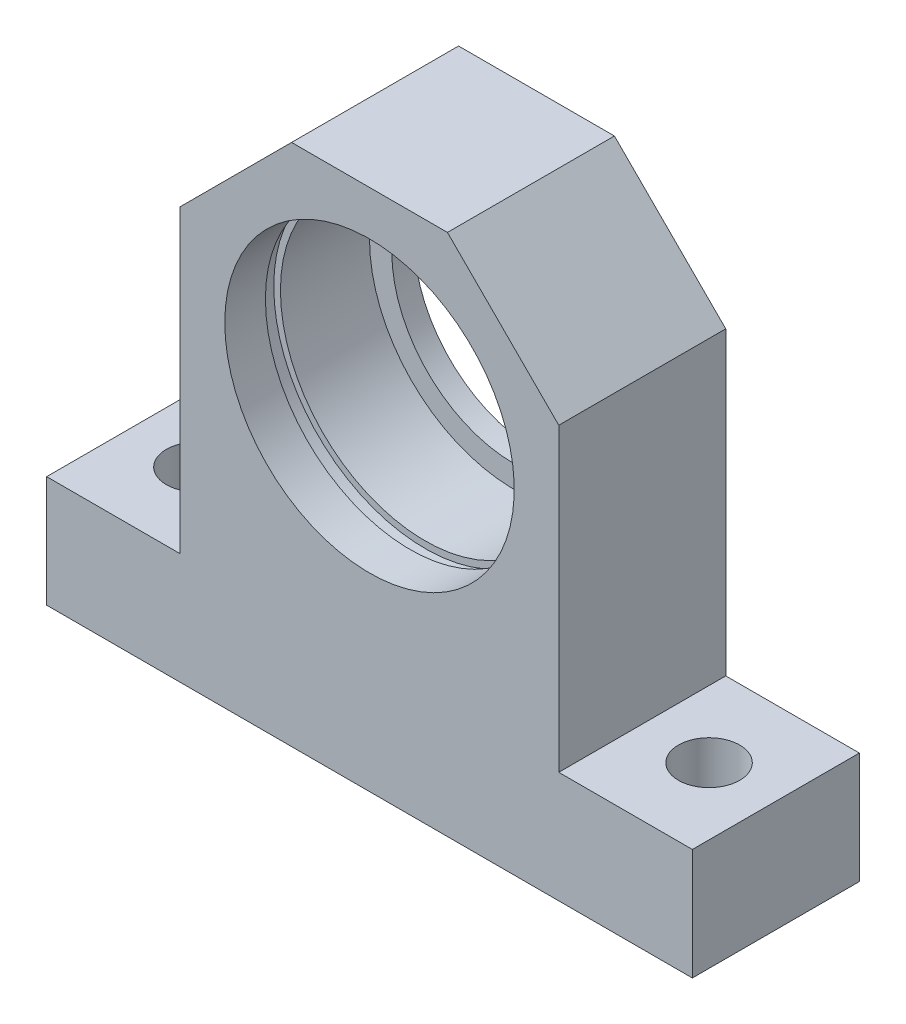
ISO-10303-21;
HEADER;
FILE_DESCRIPTION(('STEP AP214'),'2;1');
FILE_NAME('part.step','',(''),(''),'','','');
FILE_SCHEMA(('AUTOMOTIVE_DESIGN { 1 0 10303 214 1 1 1 1 }'));
ENDSEC;
DATA;
#1=APPLICATION_CONTEXT('core data for automotive mechanical design processes');
#2=APPLICATION_PROTOCOL_DEFINITION('international standard','automotive_design',2000,#1);
#3=PRODUCT_CONTEXT('',#1,'mechanical');
#4=PRODUCT('Part','Part','',(#3));
#5=PRODUCT_RELATED_PRODUCT_CATEGORY('part','',(#4));
#6=PRODUCT_DEFINITION_FORMATION('','',#4);
#7=PRODUCT_DEFINITION_CONTEXT('part definition',#1,'design');
#8=PRODUCT_DEFINITION('design','',#6,#7);
#9=PRODUCT_DEFINITION_SHAPE('','',#8);
#10=(LENGTH_UNIT() NAMED_UNIT(*) SI_UNIT(.MILLI.,.METRE.));
#11=(NAMED_UNIT(*) PLANE_ANGLE_UNIT() SI_UNIT($,.RADIAN.));
#12=(NAMED_UNIT(*) SI_UNIT($,.STERADIAN.) SOLID_ANGLE_UNIT());
#13=UNCERTAINTY_MEASURE_WITH_UNIT(LENGTH_MEASURE(1.E-05),#10,'distance_accuracy_value','');
#14=(GEOMETRIC_REPRESENTATION_CONTEXT(3) GLOBAL_UNCERTAINTY_ASSIGNED_CONTEXT((#13)) GLOBAL_UNIT_ASSIGNED_CONTEXT((#10,
#11,#12)) REPRESENTATION_CONTEXT('',''));
#15=CARTESIAN_POINT('',(0.,0.,0.));
#16=DIRECTION('',(0.,0.,1.));
#17=DIRECTION('',(1.,0.,0.));
#18=AXIS2_PLACEMENT_3D('',#15,#16,#17);
#19=CARTESIAN_POINT('',(29.,0.,-15.));
#20=DIRECTION('',(0.,-1.,0.));
#21=DIRECTION('',(0.,0.,-1.));
#22=AXIS2_PLACEMENT_3D('',#19,#20,#21);
#23=PLANE('',#22);
#24=CARTESIAN_POINT('',(-23.,0.,-7.5));
#25=DIRECTION('',(0.,1.,0.));
#26=DIRECTION('',(0.,0.,1.));
#27=AXIS2_PLACEMENT_3D('',#24,#25,#26);
#28=CIRCLE('',#27,2.75);
#29=CARTESIAN_POINT('',(-23.,0.,-4.75));
#30=VERTEX_POINT('',#29);
#31=EDGE_CURVE('E442',#30,#30,#28,.T.);
#32=ORIENTED_EDGE('',*,*,#31,.T.);
#33=EDGE_LOOP('',(#32));
#34=FACE_BOUND('',#33,.T.);
#35=DIRECTION('',(1.,0.,0.));
#36=VECTOR('',#35,1.);
#37=CARTESIAN_POINT('',(29.,0.,0.));
#38=LINE('',#37,#36);
#39=CARTESIAN_POINT('',(-29.,0.,0.));
#40=VERTEX_POINT('',#39);
#41=CARTESIAN_POINT('',(29.,0.,0.));
#42=VERTEX_POINT('',#41);
#43=EDGE_CURVE('E154',#40,#42,#38,.T.);
#44=ORIENTED_EDGE('',*,*,#43,.F.);
#45=DIRECTION('',(0.,0.,1.));
#46=VECTOR('',#45,1.);
#47=CARTESIAN_POINT('',(-29.,0.,-15.));
#48=LINE('',#47,#46);
#49=CARTESIAN_POINT('',(-29.,0.,-15.));
#50=VERTEX_POINT('',#49);
#51=EDGE_CURVE('E175',#50,#40,#48,.T.);
#52=ORIENTED_EDGE('',*,*,#51,.F.);
#53=DIRECTION('',(1.,0.,0.));
#54=VECTOR('',#53,1.);
#55=CARTESIAN_POINT('',(29.,0.,-15.));
#56=LINE('',#55,#54);
#57=CARTESIAN_POINT('',(29.,0.,-15.));
#58=VERTEX_POINT('',#57);
#59=EDGE_CURVE('E131',#50,#58,#56,.T.);
#60=ORIENTED_EDGE('',*,*,#59,.T.);
#61=DIRECTION('',(0.,0.,1.));
#62=VECTOR('',#61,1.);
#63=CARTESIAN_POINT('',(29.,0.,-15.));
#64=LINE('',#63,#62);
#65=EDGE_CURVE('E173',#58,#42,#64,.T.);
#66=ORIENTED_EDGE('',*,*,#65,.T.);
#67=EDGE_LOOP('',(#44,#52,#60,#66));
#68=FACE_BOUND('',#67,.T.);
#69=CARTESIAN_POINT('',(23.,0.,-7.5));
#70=DIRECTION('',(0.,1.,0.));
#71=DIRECTION('',(0.,0.,1.));
#72=AXIS2_PLACEMENT_3D('',#69,#70,#71);
#73=CIRCLE('',#72,2.75);
#74=CARTESIAN_POINT('',(23.,0.,-4.75));
#75=VERTEX_POINT('',#74);
#76=EDGE_CURVE('E436',#75,#75,#73,.T.);
#77=ORIENTED_EDGE('',*,*,#76,.T.);
#78=EDGE_LOOP('',(#77));
#79=FACE_BOUND('',#78,.T.);
#80=ADVANCED_FACE('F33',(#34,#68,#79),#23,.T.);
#81=CARTESIAN_POINT('',(-17.,9.99999999999999,-15.));
#82=DIRECTION('',(-1.,0.,0.));
#83=DIRECTION('',(0.,-1.,0.));
#84=AXIS2_PLACEMENT_3D('',#81,#82,#83);
#85=PLANE('',#84);
#86=DIRECTION('',(0.,-1.,0.));
#87=VECTOR('',#86,1.);
#88=CARTESIAN_POINT('',(-17.,9.99999999999999,0.));
#89=LINE('',#88,#87);
#90=CARTESIAN_POINT('',(-17.,36.9999999999999,0.));
#91=VERTEX_POINT('',#90);
#92=CARTESIAN_POINT('',(-17.,9.99999999999999,0.));
#93=VERTEX_POINT('',#92);
#94=EDGE_CURVE('E147',#91,#93,#89,.T.);
#95=ORIENTED_EDGE('',*,*,#94,.F.);
#96=DIRECTION('',(0.,0.,-1.));
#97=VECTOR('',#96,1.);
#98=CARTESIAN_POINT('',(-17.,36.9999999999999,-15.));
#99=LINE('',#98,#97);
#100=CARTESIAN_POINT('',(-17.,36.9999999999999,-15.));
#101=VERTEX_POINT('',#100);
#102=EDGE_CURVE('E11',#91,#101,#99,.T.);
#103=ORIENTED_EDGE('',*,*,#102,.T.);
#104=DIRECTION('',(0.,-1.,0.));
#105=VECTOR('',#104,1.);
#106=CARTESIAN_POINT('',(-17.,9.99999999999999,-15.));
#107=LINE('',#106,#105);
#108=CARTESIAN_POINT('',(-17.,9.99999999999999,-15.));
#109=VERTEX_POINT('',#108);
#110=EDGE_CURVE('E108',#101,#109,#107,.T.);
#111=ORIENTED_EDGE('',*,*,#110,.T.);
#112=DIRECTION('',(0.,0.,1.));
#113=VECTOR('',#112,1.);
#114=CARTESIAN_POINT('',(-17.,9.99999999999999,-15.));
#115=LINE('',#114,#113);
#116=EDGE_CURVE('E111',#109,#93,#115,.T.);
#117=ORIENTED_EDGE('',*,*,#116,.T.);
#118=EDGE_LOOP('',(#95,#103,#111,#117));
#119=FACE_BOUND('',#118,.T.);
#120=ADVANCED_FACE('F110',(#119),#85,.T.);
#121=CARTESIAN_POINT('',(-17.,47.,-15.));
#122=DIRECTION('',(0.,1.,0.));
#123=DIRECTION('',(-1.,0.,0.));
#124=AXIS2_PLACEMENT_3D('',#121,#122,#123);
#125=PLANE('',#124);
#126=DIRECTION('',(-1.,0.,0.));
#127=VECTOR('',#126,1.);
#128=CARTESIAN_POINT('',(-17.,47.,0.));
#129=LINE('',#128,#127);
#130=CARTESIAN_POINT('',(6.99999999999998,47.,0.));
#131=VERTEX_POINT('',#130);
#132=CARTESIAN_POINT('',(-6.99999999999999,47.,0.));
#133=VERTEX_POINT('',#132);
#134=EDGE_CURVE('E115',#131,#133,#129,.T.);
#135=ORIENTED_EDGE('',*,*,#134,.F.);
#136=DIRECTION('',(0.,0.,-1.));
#137=VECTOR('',#136,1.);
#138=CARTESIAN_POINT('',(6.99999999999998,47.,-15.));
#139=LINE('',#138,#137);
#140=CARTESIAN_POINT('',(6.99999999999998,47.,-15.));
#141=VERTEX_POINT('',#140);
#142=EDGE_CURVE('E187',#131,#141,#139,.T.);
#143=ORIENTED_EDGE('',*,*,#142,.T.);
#144=DIRECTION('',(-1.,0.,0.));
#145=VECTOR('',#144,1.);
#146=CARTESIAN_POINT('',(-17.,47.,-15.));
#147=LINE('',#146,#145);
#148=CARTESIAN_POINT('',(-6.99999999999999,47.,-15.));
#149=VERTEX_POINT('',#148);
#150=EDGE_CURVE('E123',#141,#149,#147,.T.);
#151=ORIENTED_EDGE('',*,*,#150,.T.);
#152=DIRECTION('',(0.,0.,1.));
#153=VECTOR('',#152,1.);
#154=CARTESIAN_POINT('',(-6.99999999999999,47.,-15.));
#155=LINE('',#154,#153);
#156=EDGE_CURVE('E184',#149,#133,#155,.T.);
#157=ORIENTED_EDGE('',*,*,#156,.T.);
#158=EDGE_LOOP('',(#135,#143,#151,#157));
#159=FACE_BOUND('',#158,.T.);
#160=ADVANCED_FACE('F203',(#159),#125,.T.);
#161=CARTESIAN_POINT('',(17.,47.,-15.));
#162=DIRECTION('',(1.,0.,0.));
#163=DIRECTION('',(0.,1.,0.));
#164=AXIS2_PLACEMENT_3D('',#161,#162,#163);
#165=PLANE('',#164);
#166=DIRECTION('',(0.,1.,0.));
#167=VECTOR('',#166,1.);
#168=CARTESIAN_POINT('',(17.,47.,-15.));
#169=LINE('',#168,#167);
#170=CARTESIAN_POINT('',(17.,10.,-15.));
#171=VERTEX_POINT('',#170);
#172=CARTESIAN_POINT('',(17.,37.,-15.));
#173=VERTEX_POINT('',#172);
#174=EDGE_CURVE('E143',#171,#173,#169,.T.);
#175=ORIENTED_EDGE('',*,*,#174,.T.);
#176=DIRECTION('',(0.,0.,1.));
#177=VECTOR('',#176,1.);
#178=CARTESIAN_POINT('',(17.,37.,-15.));
#179=LINE('',#178,#177);
#180=CARTESIAN_POINT('',(17.,37.,0.));
#181=VERTEX_POINT('',#180);
#182=EDGE_CURVE('E170',#173,#181,#179,.T.);
#183=ORIENTED_EDGE('',*,*,#182,.T.);
#184=DIRECTION('',(0.,1.,0.));
#185=VECTOR('',#184,1.);
#186=CARTESIAN_POINT('',(17.,47.,0.));
#187=LINE('',#186,#185);
#188=CARTESIAN_POINT('',(17.,10.,0.));
#189=VERTEX_POINT('',#188);
#190=EDGE_CURVE('E163',#189,#181,#187,.T.);
#191=ORIENTED_EDGE('',*,*,#190,.F.);
#192=DIRECTION('',(0.,0.,1.));
#193=VECTOR('',#192,1.);
#194=CARTESIAN_POINT('',(17.,10.,-15.));
#195=LINE('',#194,#193);
#196=EDGE_CURVE('E168',#171,#189,#195,.T.);
#197=ORIENTED_EDGE('',*,*,#196,.F.);
#198=EDGE_LOOP('',(#175,#183,#191,#197));
#199=FACE_BOUND('',#198,.T.);
#200=ADVANCED_FACE('F196',(#199),#165,.T.);
#201=CARTESIAN_POINT('',(17.,10.,-15.));
#202=DIRECTION('',(0.,1.,0.));
#203=DIRECTION('',(-1.,0.,0.));
#204=AXIS2_PLACEMENT_3D('',#201,#202,#203);
#205=PLANE('',#204);
#206=CARTESIAN_POINT('',(23.,10.,-7.5));
#207=DIRECTION('',(0.,1.,0.));
#208=DIRECTION('',(0.,0.,1.));
#209=AXIS2_PLACEMENT_3D('',#206,#207,#208);
#210=CIRCLE('',#209,2.74999999999999);
#211=CARTESIAN_POINT('',(23.,10.,-4.75000000000001));
#212=VERTEX_POINT('',#211);
#213=EDGE_CURVE('E439',#212,#212,#210,.T.);
#214=ORIENTED_EDGE('',*,*,#213,.F.);
#215=EDGE_LOOP('',(#214));
#216=FACE_BOUND('',#215,.T.);
#217=DIRECTION('',(-1.,0.,0.));
#218=VECTOR('',#217,1.);
#219=CARTESIAN_POINT('',(17.,10.,0.));
#220=LINE('',#219,#218);
#221=CARTESIAN_POINT('',(29.,9.99999999999999,0.));
#222=VERTEX_POINT('',#221);
#223=EDGE_CURVE('E160',#222,#189,#220,.T.);
#224=ORIENTED_EDGE('',*,*,#223,.F.);
#225=DIRECTION('',(0.,0.,1.));
#226=VECTOR('',#225,1.);
#227=CARTESIAN_POINT('',(29.,9.99999999999999,-15.));
#228=LINE('',#227,#226);
#229=CARTESIAN_POINT('',(29.,9.99999999999999,-15.));
#230=VERTEX_POINT('',#229);
#231=EDGE_CURVE('E171',#230,#222,#228,.T.);
#232=ORIENTED_EDGE('',*,*,#231,.F.);
#233=DIRECTION('',(-1.,0.,0.));
#234=VECTOR('',#233,1.);
#235=CARTESIAN_POINT('',(17.,10.,-15.));
#236=LINE('',#235,#234);
#237=EDGE_CURVE('E140',#230,#171,#236,.T.);
#238=ORIENTED_EDGE('',*,*,#237,.T.);
#239=ORIENTED_EDGE('',*,*,#196,.T.);
#240=EDGE_LOOP('',(#224,#232,#238,#239));
#241=FACE_BOUND('',#240,.T.);
#242=ADVANCED_FACE('F218',(#216,#241),#205,.T.);
#243=CARTESIAN_POINT('',(29.,9.99999999999999,-15.));
#244=DIRECTION('',(1.,0.,0.));
#245=DIRECTION('',(0.,0.,-1.));
#246=AXIS2_PLACEMENT_3D('',#243,#244,#245);
#247=PLANE('',#246);
#248=DIRECTION('',(0.,1.,0.));
#249=VECTOR('',#248,1.);
#250=CARTESIAN_POINT('',(29.,9.99999999999999,0.));
#251=LINE('',#250,#249);
#252=EDGE_CURVE('E157',#42,#222,#251,.T.);
#253=ORIENTED_EDGE('',*,*,#252,.F.);
#254=ORIENTED_EDGE('',*,*,#65,.F.);
#255=DIRECTION('',(0.,1.,0.));
#256=VECTOR('',#255,1.);
#257=CARTESIAN_POINT('',(29.,9.99999999999999,-15.));
#258=LINE('',#257,#256);
#259=EDGE_CURVE('E137',#58,#230,#258,.T.);
#260=ORIENTED_EDGE('',*,*,#259,.T.);
#261=ORIENTED_EDGE('',*,*,#231,.T.);
#262=EDGE_LOOP('',(#253,#254,#260,#261));
#263=FACE_BOUND('',#262,.T.);
#264=ADVANCED_FACE('F215',(#263),#247,.T.);
#265=CARTESIAN_POINT('',(-29.,0.,-15.));
#266=DIRECTION('',(-1.,0.,0.));
#267=DIRECTION('',(0.,0.,1.));
#268=AXIS2_PLACEMENT_3D('',#265,#266,#267);
#269=PLANE('',#268);
#270=DIRECTION('',(0.,-1.,0.));
#271=VECTOR('',#270,1.);
#272=CARTESIAN_POINT('',(-29.,0.,0.));
#273=LINE('',#272,#271);
#274=CARTESIAN_POINT('',(-29.,9.99999999999999,0.));
#275=VERTEX_POINT('',#274);
#276=EDGE_CURVE('E151',#275,#40,#273,.T.);
#277=ORIENTED_EDGE('',*,*,#276,.F.);
#278=DIRECTION('',(0.,0.,1.));
#279=VECTOR('',#278,1.);
#280=CARTESIAN_POINT('',(-29.,9.99999999999999,-15.));
#281=LINE('',#280,#279);
#282=CARTESIAN_POINT('',(-29.,9.99999999999999,-15.));
#283=VERTEX_POINT('',#282);
#284=EDGE_CURVE('E122',#283,#275,#281,.T.);
#285=ORIENTED_EDGE('',*,*,#284,.F.);
#286=DIRECTION('',(0.,-1.,0.));
#287=VECTOR('',#286,1.);
#288=CARTESIAN_POINT('',(-29.,0.,-15.));
#289=LINE('',#288,#287);
#290=EDGE_CURVE('E129',#283,#50,#289,.T.);
#291=ORIENTED_EDGE('',*,*,#290,.T.);
#292=ORIENTED_EDGE('',*,*,#51,.T.);
#293=EDGE_LOOP('',(#277,#285,#291,#292));
#294=FACE_BOUND('',#293,.T.);
#295=ADVANCED_FACE('F209',(#294),#269,.T.);
#296=CARTESIAN_POINT('',(-29.,9.99999999999999,-15.));
#297=DIRECTION('',(0.,1.,0.));
#298=DIRECTION('',(0.,0.,1.));
#299=AXIS2_PLACEMENT_3D('',#296,#297,#298);
#300=PLANE('',#299);
#301=CARTESIAN_POINT('',(-23.,10.,-7.5));
#302=DIRECTION('',(0.,1.,0.));
#303=DIRECTION('',(0.,0.,1.));
#304=AXIS2_PLACEMENT_3D('',#301,#302,#303);
#305=CIRCLE('',#304,2.74999999999999);
#306=CARTESIAN_POINT('',(-23.,10.,-4.75000000000001));
#307=VERTEX_POINT('',#306);
#308=EDGE_CURVE('E444',#307,#307,#305,.T.);
#309=ORIENTED_EDGE('',*,*,#308,.F.);
#310=EDGE_LOOP('',(#309));
#311=FACE_BOUND('',#310,.T.);
#312=DIRECTION('',(-1.,0.,0.));
#313=VECTOR('',#312,1.);
#314=CARTESIAN_POINT('',(-29.,9.99999999999999,0.));
#315=LINE('',#314,#313);
#316=EDGE_CURVE('E121',#93,#275,#315,.T.);
#317=ORIENTED_EDGE('',*,*,#316,.F.);
#318=ORIENTED_EDGE('',*,*,#116,.F.);
#319=DIRECTION('',(-1.,0.,0.));
#320=VECTOR('',#319,1.);
#321=CARTESIAN_POINT('',(-29.,9.99999999999999,-15.));
#322=LINE('',#321,#320);
#323=EDGE_CURVE('E114',#109,#283,#322,.T.);
#324=ORIENTED_EDGE('',*,*,#323,.T.);
#325=ORIENTED_EDGE('',*,*,#284,.T.);
#326=EDGE_LOOP('',(#317,#318,#324,#325));
#327=FACE_BOUND('',#326,.T.);
#328=ADVANCED_FACE('F119',(#311,#327),#300,.T.);
#329=CARTESIAN_POINT('',(0.,0.,-15.));
#330=DIRECTION('',(0.,0.,-1.));
#331=DIRECTION('',(-1.,0.,0.));
#332=AXIS2_PLACEMENT_3D('',#329,#330,#331);
#333=PLANE('',#332);
#334=CARTESIAN_POINT('',(0.,30.,-15.));
#335=DIRECTION('',(0.,0.,-1.));
#336=DIRECTION('',(-1.,0.,0.));
#337=AXIS2_PLACEMENT_3D('',#334,#335,#336);
#338=CIRCLE('',#337,11.);
#339=CARTESIAN_POINT('',(-11.,30.,-15.));
#340=VERTEX_POINT('',#339);
#341=EDGE_CURVE('E414',#340,#340,#338,.T.);
#342=ORIENTED_EDGE('',*,*,#341,.F.);
#343=EDGE_LOOP('',(#342));
#344=FACE_BOUND('',#343,.T.);
#345=ORIENTED_EDGE('',*,*,#150,.F.);
#346=DIRECTION('',(-0.707106781186549,0.707106781186546,0.));
#347=VECTOR('',#346,1.);
#348=CARTESIAN_POINT('',(27.,27.0000000000001,-15.));
#349=LINE('',#348,#347);
#350=EDGE_CURVE('E41',#141,#173,#349,.F.);
#351=ORIENTED_EDGE('',*,*,#350,.T.);
#352=ORIENTED_EDGE('',*,*,#174,.F.);
#353=ORIENTED_EDGE('',*,*,#237,.F.);
#354=ORIENTED_EDGE('',*,*,#259,.F.);
#355=ORIENTED_EDGE('',*,*,#59,.F.);
#356=ORIENTED_EDGE('',*,*,#290,.F.);
#357=ORIENTED_EDGE('',*,*,#323,.F.);
#358=ORIENTED_EDGE('',*,*,#110,.F.);
#359=DIRECTION('',(-0.707106781186546,-0.707106781186549,0.));
#360=VECTOR('',#359,1.);
#361=CARTESIAN_POINT('',(-27.,26.9999999999999,-15.));
#362=LINE('',#361,#360);
#363=EDGE_CURVE('E53',#101,#149,#362,.F.);
#364=ORIENTED_EDGE('',*,*,#363,.T.);
#365=EDGE_LOOP('',(#345,#351,#352,#353,#354,#355,#356,#357,#358,#364));
#366=FACE_BOUND('',#365,.T.);
#367=ADVANCED_FACE('F126',(#344,#366),#333,.T.);
#368=CARTESIAN_POINT('',(0.,0.,0.));
#369=DIRECTION('',(0.,0.,-1.));
#370=DIRECTION('',(-1.,0.,0.));
#371=AXIS2_PLACEMENT_3D('',#368,#369,#370);
#372=PLANE('',#371);
#373=CARTESIAN_POINT('',(0.,30.,0.));
#374=DIRECTION('',(0.,0.,-1.));
#375=DIRECTION('',(-1.,0.,0.));
#376=AXIS2_PLACEMENT_3D('',#373,#374,#375);
#377=CIRCLE('',#376,13.);
#378=CARTESIAN_POINT('',(-13.,30.,0.));
#379=VERTEX_POINT('',#378);
#380=EDGE_CURVE('E149',#379,#379,#377,.T.);
#381=ORIENTED_EDGE('',*,*,#380,.T.);
#382=EDGE_LOOP('',(#381));
#383=FACE_BOUND('',#382,.T.);
#384=ORIENTED_EDGE('',*,*,#190,.T.);
#385=DIRECTION('',(0.707106781186549,-0.707106781186546,0.));
#386=VECTOR('',#385,1.);
#387=CARTESIAN_POINT('',(17.,37.,0.));
#388=LINE('',#387,#386);
#389=EDGE_CURVE('E182',#181,#131,#388,.F.);
#390=ORIENTED_EDGE('',*,*,#389,.T.);
#391=ORIENTED_EDGE('',*,*,#134,.T.);
#392=DIRECTION('',(0.707106781186546,0.707106781186549,0.));
#393=VECTOR('',#392,1.);
#394=CARTESIAN_POINT('',(-6.99999999999999,47.,0.));
#395=LINE('',#394,#393);
#396=EDGE_CURVE('E180',#133,#91,#395,.F.);
#397=ORIENTED_EDGE('',*,*,#396,.T.);
#398=ORIENTED_EDGE('',*,*,#94,.T.);
#399=ORIENTED_EDGE('',*,*,#316,.T.);
#400=ORIENTED_EDGE('',*,*,#276,.T.);
#401=ORIENTED_EDGE('',*,*,#43,.T.);
#402=ORIENTED_EDGE('',*,*,#252,.T.);
#403=ORIENTED_EDGE('',*,*,#223,.T.);
#404=EDGE_LOOP('',(#384,#390,#391,#397,#398,#399,#400,#401,#402,#403));
#405=FACE_BOUND('',#404,.T.);
#406=ADVANCED_FACE('F201',(#383,#405),#372,.F.);
#407=CARTESIAN_POINT('',(0.,30.,-15.));
#408=DIRECTION('',(0.,0.,-1.));
#409=DIRECTION('',(-1.,0.,0.));
#410=AXIS2_PLACEMENT_3D('',#407,#408,#409);
#411=CYLINDRICAL_SURFACE('',#410,13.);
#412=ORIENTED_EDGE('',*,*,#380,.F.);
#413=EDGE_LOOP('',(#412));
#414=FACE_BOUND('',#413,.T.);
#415=CARTESIAN_POINT('',(0.,30.,-3.65));
#416=DIRECTION('',(0.,0.,-1.));
#417=DIRECTION('',(-1.,0.,0.));
#418=AXIS2_PLACEMENT_3D('',#415,#416,#417);
#419=CIRCLE('',#418,13.);
#420=CARTESIAN_POINT('',(-13.,30.,-3.65));
#421=VERTEX_POINT('',#420);
#422=EDGE_CURVE('E433',#421,#421,#419,.T.);
#423=ORIENTED_EDGE('',*,*,#422,.T.);
#424=EDGE_LOOP('',(#423));
#425=FACE_BOUND('',#424,.T.);
#426=ADVANCED_FACE('F282',(#414,#425),#411,.F.);
#427=CARTESIAN_POINT('',(0.,30.,-15.));
#428=DIRECTION('',(0.,0.,-1.));
#429=DIRECTION('',(-1.,0.,0.));
#430=AXIS2_PLACEMENT_3D('',#427,#428,#429);
#431=CYLINDRICAL_SURFACE('',#430,11.);
#432=CARTESIAN_POINT('',(0.,30.,-13.));
#433=DIRECTION('',(0.,0.,-1.));
#434=DIRECTION('',(-1.,0.,0.));
#435=AXIS2_PLACEMENT_3D('',#432,#433,#434);
#436=CIRCLE('',#435,11.);
#437=CARTESIAN_POINT('',(-11.,30.,-13.));
#438=VERTEX_POINT('',#437);
#439=EDGE_CURVE('E416',#438,#438,#436,.T.);
#440=ORIENTED_EDGE('',*,*,#439,.F.);
#441=EDGE_LOOP('',(#440));
#442=FACE_BOUND('',#441,.T.);
#443=ORIENTED_EDGE('',*,*,#341,.T.);
#444=EDGE_LOOP('',(#443));
#445=FACE_BOUND('',#444,.T.);
#446=ADVANCED_FACE('F278',(#442,#445),#431,.F.);
#447=CARTESIAN_POINT('',(0.,43.,-13.));
#448=DIRECTION('',(0.,0.,-1.));
#449=DIRECTION('',(-1.,0.,0.));
#450=AXIS2_PLACEMENT_3D('',#447,#448,#449);
#451=PLANE('',#450);
#452=CARTESIAN_POINT('',(0.,30.,-13.));
#453=DIRECTION('',(0.,0.,-1.));
#454=DIRECTION('',(-1.,0.,0.));
#455=AXIS2_PLACEMENT_3D('',#452,#453,#454);
#456=CIRCLE('',#455,13.);
#457=CARTESIAN_POINT('',(-13.,30.,-13.));
#458=VERTEX_POINT('',#457);
#459=EDGE_CURVE('E421',#458,#458,#456,.T.);
#460=ORIENTED_EDGE('',*,*,#459,.F.);
#461=EDGE_LOOP('',(#460));
#462=FACE_BOUND('',#461,.T.);
#463=ORIENTED_EDGE('',*,*,#439,.T.);
#464=EDGE_LOOP('',(#463));
#465=FACE_BOUND('',#464,.T.);
#466=ADVANCED_FACE('F274',(#462,#465),#451,.F.);
#467=CARTESIAN_POINT('',(0.,30.,-15.));
#468=DIRECTION('',(0.,0.,-1.));
#469=DIRECTION('',(-1.,0.,0.));
#470=AXIS2_PLACEMENT_3D('',#467,#468,#469);
#471=CYLINDRICAL_SURFACE('',#470,13.);
#472=CARTESIAN_POINT('',(0.,30.,-5.));
#473=DIRECTION('',(0.,0.,-1.));
#474=DIRECTION('',(-1.,0.,0.));
#475=AXIS2_PLACEMENT_3D('',#472,#473,#474);
#476=CIRCLE('',#475,13.);
#477=CARTESIAN_POINT('',(-13.,30.,-5.));
#478=VERTEX_POINT('',#477);
#479=EDGE_CURVE('E424',#478,#478,#476,.T.);
#480=ORIENTED_EDGE('',*,*,#479,.F.);
#481=EDGE_LOOP('',(#480));
#482=FACE_BOUND('',#481,.T.);
#483=ORIENTED_EDGE('',*,*,#459,.T.);
#484=EDGE_LOOP('',(#483));
#485=FACE_BOUND('',#484,.T.);
#486=ADVANCED_FACE('F270',(#482,#485),#471,.F.);
#487=CARTESIAN_POINT('',(0.,43.6,-5.));
#488=DIRECTION('',(0.,0.,-1.));
#489=DIRECTION('',(-1.,0.,0.));
#490=AXIS2_PLACEMENT_3D('',#487,#488,#489);
#491=PLANE('',#490);
#492=CARTESIAN_POINT('',(0.,30.,-5.));
#493=DIRECTION('',(0.,0.,-1.));
#494=DIRECTION('',(-1.,0.,0.));
#495=AXIS2_PLACEMENT_3D('',#492,#493,#494);
#496=CIRCLE('',#495,13.6);
#497=CARTESIAN_POINT('',(-13.6,30.,-5.));
#498=VERTEX_POINT('',#497);
#499=EDGE_CURVE('E427',#498,#498,#496,.T.);
#500=ORIENTED_EDGE('',*,*,#499,.F.);
#501=EDGE_LOOP('',(#500));
#502=FACE_BOUND('',#501,.T.);
#503=ORIENTED_EDGE('',*,*,#479,.T.);
#504=EDGE_LOOP('',(#503));
#505=FACE_BOUND('',#504,.T.);
#506=ADVANCED_FACE('F266',(#502,#505),#491,.F.);
#507=CARTESIAN_POINT('',(0.,30.,-15.));
#508=DIRECTION('',(0.,0.,-1.));
#509=DIRECTION('',(-1.,0.,0.));
#510=AXIS2_PLACEMENT_3D('',#507,#508,#509);
#511=CYLINDRICAL_SURFACE('',#510,13.6);
#512=CARTESIAN_POINT('',(0.,30.,-3.65));
#513=DIRECTION('',(0.,0.,-1.));
#514=DIRECTION('',(-1.,0.,0.));
#515=AXIS2_PLACEMENT_3D('',#512,#513,#514);
#516=CIRCLE('',#515,13.6);
#517=CARTESIAN_POINT('',(-13.6,30.,-3.65));
#518=VERTEX_POINT('',#517);
#519=EDGE_CURVE('E430',#518,#518,#516,.T.);
#520=ORIENTED_EDGE('',*,*,#519,.F.);
#521=EDGE_LOOP('',(#520));
#522=FACE_BOUND('',#521,.T.);
#523=ORIENTED_EDGE('',*,*,#499,.T.);
#524=EDGE_LOOP('',(#523));
#525=FACE_BOUND('',#524,.T.);
#526=ADVANCED_FACE('F262',(#522,#525),#511,.F.);
#527=CARTESIAN_POINT('',(0.,43.,-3.65));
#528=DIRECTION('',(0.,0.,1.));
#529=DIRECTION('',(1.,0.,0.));
#530=AXIS2_PLACEMENT_3D('',#527,#528,#529);
#531=PLANE('',#530);
#532=ORIENTED_EDGE('',*,*,#422,.F.);
#533=EDGE_LOOP('',(#532));
#534=FACE_BOUND('',#533,.T.);
#535=ORIENTED_EDGE('',*,*,#519,.T.);
#536=EDGE_LOOP('',(#535));
#537=FACE_BOUND('',#536,.T.);
#538=ADVANCED_FACE('F254',(#534,#537),#531,.F.);
#539=CARTESIAN_POINT('',(23.,9.99999999999999,-7.5));
#540=DIRECTION('',(0.,1.,0.));
#541=DIRECTION('',(0.,0.,1.));
#542=AXIS2_PLACEMENT_3D('',#539,#540,#541);
#543=CYLINDRICAL_SURFACE('',#542,2.74999999999999);
#544=ORIENTED_EDGE('',*,*,#76,.F.);
#545=EDGE_LOOP('',(#544));
#546=FACE_BOUND('',#545,.T.);
#547=ORIENTED_EDGE('',*,*,#213,.T.);
#548=EDGE_LOOP('',(#547));
#549=FACE_BOUND('',#548,.T.);
#550=ADVANCED_FACE('F248',(#546,#549),#543,.F.);
#551=CARTESIAN_POINT('',(-23.,9.99999999999999,-7.5));
#552=DIRECTION('',(0.,1.,0.));
#553=DIRECTION('',(0.,0.,1.));
#554=AXIS2_PLACEMENT_3D('',#551,#552,#553);
#555=CYLINDRICAL_SURFACE('',#554,2.74999999999999);
#556=ORIENTED_EDGE('',*,*,#31,.F.);
#557=EDGE_LOOP('',(#556));
#558=FACE_BOUND('',#557,.T.);
#559=ORIENTED_EDGE('',*,*,#308,.T.);
#560=EDGE_LOOP('',(#559));
#561=FACE_BOUND('',#560,.T.);
#562=ADVANCED_FACE('F243',(#558,#561),#555,.F.);
#563=CARTESIAN_POINT('',(17.,37.,-15.));
#564=DIRECTION('',(-0.707106781186546,-0.707106781186549,0.));
#565=DIRECTION('',(0.,0.,1.));
#566=AXIS2_PLACEMENT_3D('',#563,#564,#565);
#567=PLANE('',#566);
#568=ORIENTED_EDGE('',*,*,#350,.F.);
#569=ORIENTED_EDGE('',*,*,#142,.F.);
#570=ORIENTED_EDGE('',*,*,#389,.F.);
#571=ORIENTED_EDGE('',*,*,#182,.F.);
#572=EDGE_LOOP('',(#568,#569,#570,#571));
#573=FACE_BOUND('',#572,.T.);
#574=ADVANCED_FACE('F198',(#573),#567,.F.);
#575=CARTESIAN_POINT('',(-6.99999999999999,47.,-15.));
#576=DIRECTION('',(0.707106781186549,-0.707106781186546,0.));
#577=DIRECTION('',(0.,0.,1.));
#578=AXIS2_PLACEMENT_3D('',#575,#576,#577);
#579=PLANE('',#578);
#580=ORIENTED_EDGE('',*,*,#363,.F.);
#581=ORIENTED_EDGE('',*,*,#102,.F.);
#582=ORIENTED_EDGE('',*,*,#396,.F.);
#583=ORIENTED_EDGE('',*,*,#156,.F.);
#584=EDGE_LOOP('',(#580,#581,#582,#583));
#585=FACE_BOUND('',#584,.T.);
#586=ADVANCED_FACE('F35',(#585),#579,.F.);
#587=CLOSED_SHELL('',(#80,#120,#160,#200,#242,#264,#295,#328,#367,#406,#426,#446,#466,#486,#506,
#526,#538,#550,#562,#574,#586));
#588=MANIFOLD_SOLID_BREP('B2',#587);
#589=ADVANCED_BREP_SHAPE_REPRESENTATION('',(#18,#588),#14);
#590=SHAPE_DEFINITION_REPRESENTATION(#9,#589);
ENDSEC;
END-ISO-10303-21;
